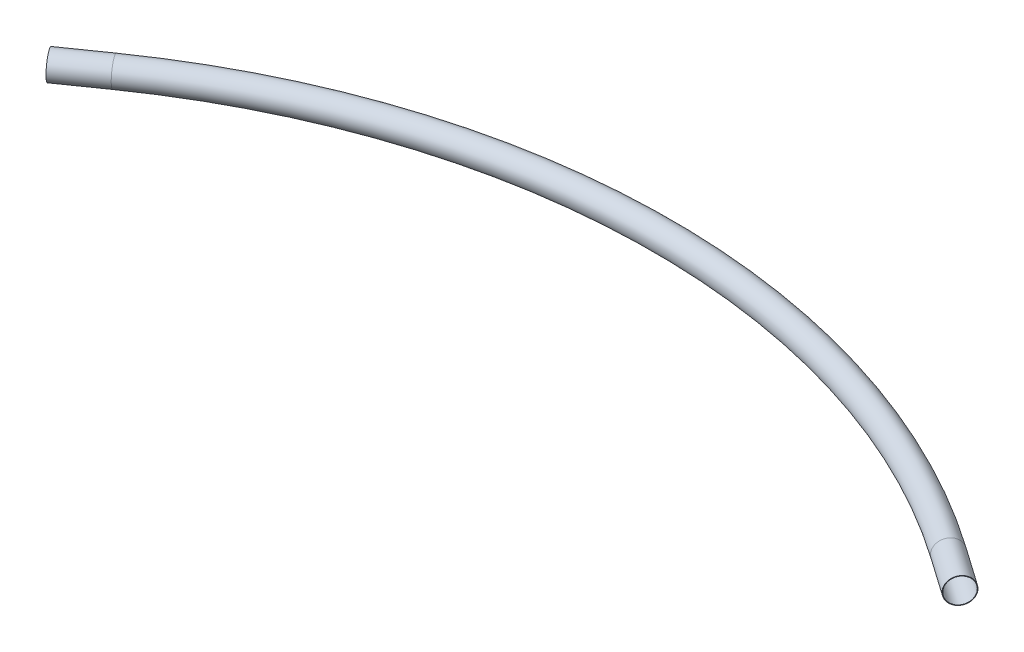
ISO-10303-21;
HEADER;
FILE_DESCRIPTION(('STEP AP214'),'2;1');
FILE_NAME('part.step','',(''),(''),'','','');
FILE_SCHEMA(('AUTOMOTIVE_DESIGN { 1 0 10303 214 1 1 1 1 }'));
ENDSEC;
DATA;
#1=APPLICATION_CONTEXT('core data for automotive mechanical design processes');
#2=APPLICATION_PROTOCOL_DEFINITION('international standard','automotive_design',2000,#1);
#3=PRODUCT_CONTEXT('',#1,'mechanical');
#4=PRODUCT('Part','Part','',(#3));
#5=PRODUCT_RELATED_PRODUCT_CATEGORY('part','',(#4));
#6=PRODUCT_DEFINITION_FORMATION('','',#4);
#7=PRODUCT_DEFINITION_CONTEXT('part definition',#1,'design');
#8=PRODUCT_DEFINITION('design','',#6,#7);
#9=PRODUCT_DEFINITION_SHAPE('','',#8);
#10=(LENGTH_UNIT() NAMED_UNIT(*) SI_UNIT(.MILLI.,.METRE.));
#11=(NAMED_UNIT(*) PLANE_ANGLE_UNIT() SI_UNIT($,.RADIAN.));
#12=(NAMED_UNIT(*) SI_UNIT($,.STERADIAN.) SOLID_ANGLE_UNIT());
#13=UNCERTAINTY_MEASURE_WITH_UNIT(LENGTH_MEASURE(1.E-05),#10,'distance_accuracy_value','');
#14=(GEOMETRIC_REPRESENTATION_CONTEXT(3) GLOBAL_UNCERTAINTY_ASSIGNED_CONTEXT((#13)) GLOBAL_UNIT_ASSIGNED_CONTEXT((#10,
#11,#12)) REPRESENTATION_CONTEXT('',''));
#15=CARTESIAN_POINT('',(0.,0.,0.));
#16=DIRECTION('',(0.,0.,1.));
#17=DIRECTION('',(1.,0.,0.));
#18=AXIS2_PLACEMENT_3D('',#15,#16,#17);
#19=CARTESIAN_POINT('',(-2964.33247070961,0.,174.783348954667));
#20=DIRECTION('',(0.819250231986912,0.,-0.573436184234471));
#21=DIRECTION('',(-0.573436184234471,0.,-0.819250231986912));
#22=AXIS2_PLACEMENT_3D('',#19,#20,#21);
#23=CYLINDRICAL_SURFACE('',#22,80.7338999999999);
#24=CARTESIAN_POINT('',(-2964.33247070961,0.,174.783348954667));
#25=DIRECTION('',(-0.819250231986912,0.,0.573436184234472));
#26=DIRECTION('',(0.573436184234472,0.,0.819250231986912));
#27=AXIS2_PLACEMENT_3D('',#24,#25,#26);
#28=CIRCLE('',#27,80.7338999999999);
#29=CARTESIAN_POINT('',(-2918.03673115524,0.,240.924615258875));
#30=VERTEX_POINT('',#29);
#31=EDGE_CURVE('E52',#30,#30,#28,.T.);
#32=ORIENTED_EDGE('',*,*,#31,.T.);
#33=EDGE_LOOP('',(#32));
#34=FACE_BOUND('',#33,.T.);
#35=CARTESIAN_POINT('',(-2714.625,0.,0.));
#36=DIRECTION('',(-0.819250231986912,0.,0.573436184234472));
#37=DIRECTION('',(0.573436184234472,0.,0.819250231986912));
#38=AXIS2_PLACEMENT_3D('',#35,#36,#37);
#39=CIRCLE('',#38,80.7338999999999);
#40=CARTESIAN_POINT('',(-2668.32926044563,0.,66.1412663042081));
#41=VERTEX_POINT('',#40);
#42=EDGE_CURVE('E58',#41,#41,#39,.T.);
#43=ORIENTED_EDGE('',*,*,#42,.F.);
#44=EDGE_LOOP('',(#43));
#45=FACE_BOUND('',#44,.T.);
#46=ADVANCED_FACE('F45',(#34,#45),#23,.F.);
#47=CARTESIAN_POINT('',(-2964.33247070961,0.,174.783348954667));
#48=DIRECTION('',(0.819250231986912,0.,-0.573436184234471));
#49=DIRECTION('',(-0.573436184234471,0.,-0.819250231986912));
#50=AXIS2_PLACEMENT_3D('',#47,#48,#49);
#51=CYLINDRICAL_SURFACE('',#50,84.1375000000001);
#52=CARTESIAN_POINT('',(-2964.33247070961,0.,174.783348954667));
#53=DIRECTION('',(-0.819250231986912,0.,0.573436184234472));
#54=DIRECTION('',(0.573436184234472,0.,0.819250231986912));
#55=AXIS2_PLACEMENT_3D('',#52,#53,#54);
#56=CIRCLE('',#55,84.1375000000001);
#57=CARTESIAN_POINT('',(-2916.08498375858,0.,243.713015348466));
#58=VERTEX_POINT('',#57);
#59=EDGE_CURVE('E12',#58,#58,#56,.T.);
#60=ORIENTED_EDGE('',*,*,#59,.F.);
#61=EDGE_LOOP('',(#60));
#62=FACE_BOUND('',#61,.T.);
#63=CARTESIAN_POINT('',(-2714.625,0.,0.));
#64=DIRECTION('',(-0.819250231986912,0.,0.573436184234472));
#65=DIRECTION('',(0.573436184234472,0.,0.819250231986912));
#66=AXIS2_PLACEMENT_3D('',#63,#64,#65);
#67=CIRCLE('',#66,84.1375000000001);
#68=CARTESIAN_POINT('',(-2666.37751304897,0.,68.9296663937989));
#69=VERTEX_POINT('',#68);
#70=EDGE_CURVE('E48',#69,#69,#67,.T.);
#71=ORIENTED_EDGE('',*,*,#70,.T.);
#72=EDGE_LOOP('',(#71));
#73=FACE_BOUND('',#72,.T.);
#74=ADVANCED_FACE('F65',(#62,#73),#51,.T.);
#75=CARTESIAN_POINT('',(-2964.33247070961,0.,174.783348954667));
#76=DIRECTION('',(-0.819250231986912,0.,0.573436184234472));
#77=DIRECTION('',(0.573436184234472,0.,0.819250231986912));
#78=AXIS2_PLACEMENT_3D('',#75,#76,#77);
#79=PLANE('',#78);
#80=ORIENTED_EDGE('',*,*,#31,.F.);
#81=EDGE_LOOP('',(#80));
#82=FACE_BOUND('',#81,.T.);
#83=ORIENTED_EDGE('',*,*,#59,.T.);
#84=EDGE_LOOP('',(#83));
#85=FACE_BOUND('',#84,.T.);
#86=ADVANCED_FACE('F69',(#82,#85),#79,.T.);
#87=CARTESIAN_POINT('',(-2714.625,0.,0.));
#88=DIRECTION('',(-0.819250231986912,0.,0.573436184234472));
#89=DIRECTION('',(0.573436184234472,0.,0.819250231986912));
#90=AXIS2_PLACEMENT_3D('',#87,#88,#89);
#91=PLANE('',#90);
#92=ORIENTED_EDGE('',*,*,#42,.T.);
#93=EDGE_LOOP('',(#92));
#94=FACE_BOUND('',#93,.T.);
#95=ORIENTED_EDGE('',*,*,#70,.F.);
#96=EDGE_LOOP('',(#95));
#97=FACE_BOUND('',#96,.T.);
#98=ADVANCED_FACE('F67',(#94,#97),#91,.F.);
#99=CLOSED_SHELL('',(#46,#74,#86,#98));
#100=MANIFOLD_SOLID_BREP('B2',#99);
#101=CARTESIAN_POINT('',(0.,0.,3878.29931586271));
#102=DIRECTION('',(0.,-1.,0.));
#103=DIRECTION('',(0.,0.,-1.));
#104=AXIS2_PLACEMENT_3D('',#101,#102,#103);
#105=TOROIDAL_SURFACE('',#104,4733.96181586271,80.7338999999999);
#106=CARTESIAN_POINT('',(-2714.625,0.,0.));
#107=DIRECTION('',(-0.819250231986912,0.,0.573436184234471));
#108=DIRECTION('',(0.573436184234472,0.,0.819250231986912));
#109=AXIS2_PLACEMENT_3D('',#106,#107,#108);
#110=CIRCLE('',#109,80.7338999999999);
#111=CARTESIAN_POINT('',(-2760.92073955437,0.,-66.141266304208));
#112=VERTEX_POINT('',#111);
#113=EDGE_CURVE('E129',#112,#112,#110,.T.);
#114=CARTESIAN_POINT('',(2714.625,0.,6.66133814775094E-13));
#115=DIRECTION('',(-0.819250231986912,0.,-0.573436184234471));
#116=DIRECTION('',(-0.573436184234471,0.,0.819250231986912));
#117=AXIS2_PLACEMENT_3D('',#114,#115,#116);
#118=CIRCLE('',#117,80.7338999999999);
#119=CARTESIAN_POINT('',(2760.92073955437,0.,-66.1412663042076));
#120=VERTEX_POINT('',#119);
#121=EDGE_CURVE('E137',#120,#120,#118,.T.);
#122=CARTESIAN_POINT('',(0.,0.,3878.29931586271));
#123=DIRECTION('',(0.,-1.,0.));
#124=DIRECTION('',(0.,0.,-1.));
#125=AXIS2_PLACEMENT_3D('',#122,#123,#124);
#126=CIRCLE('',#125,4814.69571586271);
#127=EDGE_CURVE('',#112,#120,#126,.T.);
#128=ORIENTED_EDGE('',*,*,#113,.T.);
#129=ORIENTED_EDGE('',*,*,#121,.F.);
#130=ORIENTED_EDGE('',*,*,#127,.T.);
#131=ORIENTED_EDGE('',*,*,#127,.F.);
#132=EDGE_LOOP('',(#128,#130,#129,#131));
#133=FACE_BOUND('',#132,.T.);
#134=ADVANCED_FACE('F122',(#133),#105,.F.);
#135=CARTESIAN_POINT('',(0.,0.,3878.29931586271));
#136=DIRECTION('',(0.,-1.,0.));
#137=DIRECTION('',(0.,0.,-1.));
#138=AXIS2_PLACEMENT_3D('',#135,#136,#137);
#139=TOROIDAL_SURFACE('',#138,4733.96181586271,84.1375000000001);
#140=CARTESIAN_POINT('',(-2714.625,0.,0.));
#141=DIRECTION('',(-0.819250231986912,0.,0.573436184234471));
#142=DIRECTION('',(0.573436184234472,0.,0.819250231986912));
#143=AXIS2_PLACEMENT_3D('',#140,#141,#142);
#144=CIRCLE('',#143,84.1375000000001);
#145=CARTESIAN_POINT('',(-2762.87248695103,0.,-68.9296663937986));
#146=VERTEX_POINT('',#145);
#147=EDGE_CURVE('E44',#146,#146,#144,.T.);
#148=CARTESIAN_POINT('',(2714.625,0.,6.66133814775094E-13));
#149=DIRECTION('',(-0.819250231986912,0.,-0.573436184234471));
#150=DIRECTION('',(-0.573436184234471,0.,0.819250231986912));
#151=AXIS2_PLACEMENT_3D('',#148,#149,#150);
#152=CIRCLE('',#151,84.1375000000001);
#153=CARTESIAN_POINT('',(2762.87248695103,0.,-68.9296663937977));
#154=VERTEX_POINT('',#153);
#155=EDGE_CURVE('E133',#154,#154,#152,.T.);
#156=CARTESIAN_POINT('',(0.,0.,3878.29931586271));
#157=DIRECTION('',(0.,-1.,0.));
#158=DIRECTION('',(0.,0.,-1.));
#159=AXIS2_PLACEMENT_3D('',#156,#157,#158);
#160=CIRCLE('',#159,4818.09931586271);
#161=EDGE_CURVE('',#146,#154,#160,.T.);
#162=ORIENTED_EDGE('',*,*,#147,.F.);
#163=ORIENTED_EDGE('',*,*,#155,.T.);
#164=ORIENTED_EDGE('',*,*,#161,.T.);
#165=ORIENTED_EDGE('',*,*,#161,.F.);
#166=EDGE_LOOP('',(#162,#164,#163,#165));
#167=FACE_BOUND('',#166,.T.);
#168=ADVANCED_FACE('F124',(#167),#139,.T.);
#169=CARTESIAN_POINT('',(-2714.625,0.,0.));
#170=DIRECTION('',(-0.819250231986912,0.,0.573436184234471));
#171=DIRECTION('',(0.573436184234472,0.,0.819250231986912));
#172=AXIS2_PLACEMENT_3D('',#169,#170,#171);
#173=PLANE('',#172);
#174=ORIENTED_EDGE('',*,*,#113,.F.);
#175=EDGE_LOOP('',(#174));
#176=FACE_BOUND('',#175,.T.);
#177=ORIENTED_EDGE('',*,*,#147,.T.);
#178=EDGE_LOOP('',(#177));
#179=FACE_BOUND('',#178,.T.);
#180=ADVANCED_FACE('F147',(#176,#179),#173,.T.);
#181=CARTESIAN_POINT('',(2714.625,0.,6.66133814775094E-13));
#182=DIRECTION('',(-0.819250231986912,0.,-0.573436184234471));
#183=DIRECTION('',(-0.573436184234471,0.,0.819250231986912));
#184=AXIS2_PLACEMENT_3D('',#181,#182,#183);
#185=PLANE('',#184);
#186=ORIENTED_EDGE('',*,*,#121,.T.);
#187=EDGE_LOOP('',(#186));
#188=FACE_BOUND('',#187,.T.);
#189=ORIENTED_EDGE('',*,*,#155,.F.);
#190=EDGE_LOOP('',(#189));
#191=FACE_BOUND('',#190,.T.);
#192=ADVANCED_FACE('F143',(#188,#191),#185,.F.);
#193=CLOSED_SHELL('',(#134,#168,#180,#192));
#194=MANIFOLD_SOLID_BREP('B7',#193);
#195=CARTESIAN_POINT('',(2714.625,0.,6.66133814775094E-13));
#196=DIRECTION('',(0.819250231986912,0.,0.573436184234471));
#197=DIRECTION('',(0.573436184234471,0.,-0.819250231986912));
#198=AXIS2_PLACEMENT_3D('',#195,#196,#197);
#199=CYLINDRICAL_SURFACE('',#198,80.7338999999999);
#200=CARTESIAN_POINT('',(2714.625,0.,6.66133814775094E-13));
#201=DIRECTION('',(-0.819250231986912,0.,-0.573436184234471));
#202=DIRECTION('',(-0.573436184234471,0.,0.819250231986912));
#203=AXIS2_PLACEMENT_3D('',#200,#201,#202);
#204=CIRCLE('',#203,80.7338999999999);
#205=CARTESIAN_POINT('',(2760.92073955437,0.,-66.1412663042074));
#206=VERTEX_POINT('',#205);
#207=EDGE_CURVE('E199',#206,#206,#204,.T.);
#208=CARTESIAN_POINT('',(2964.33247070961,0.,174.783348954667));
#209=DIRECTION('',(-0.819250231986912,0.,-0.573436184234471));
#210=DIRECTION('',(-0.573436184234471,0.,0.819250231986912));
#211=AXIS2_PLACEMENT_3D('',#208,#209,#210);
#212=CIRCLE('',#211,80.7338999999999);
#213=CARTESIAN_POINT('',(3010.62821026398,0.,108.642082650459));
#214=VERTEX_POINT('',#213);
#215=EDGE_CURVE('E205',#214,#214,#212,.T.);
#216=CARTESIAN_POINT('',(2760.92073955437,0.,-66.1412663042074));
#217=CARTESIAN_POINT('',(2763.52185904093,0.,-64.320606419263));
#218=CARTESIAN_POINT('',(2766.12297852748,0.,-62.4999465343185));
#219=CARTESIAN_POINT('',(2771.3252175006,0.,-58.8586267644296));
#220=CARTESIAN_POINT('',(2773.92633698716,0.,-57.0379668794851));
#221=CARTESIAN_POINT('',(2779.12857596028,0.,-53.3966471095962));
#222=CARTESIAN_POINT('',(2781.72969544684,0.,-51.5759872246518));
#223=CARTESIAN_POINT('',(2786.93193441995,0.,-47.934667454763));
#224=CARTESIAN_POINT('',(2789.53305390651,0.,-46.1140075698185));
#225=CARTESIAN_POINT('',(2794.73529287963,0.,-42.4726877999296));
#226=CARTESIAN_POINT('',(2797.33641236619,0.,-40.6520279149851));
#227=CARTESIAN_POINT('',(2802.5386513393,0.,-37.0107081450963));
#228=CARTESIAN_POINT('',(2805.13977082586,0.,-35.1900482601518));
#229=CARTESIAN_POINT('',(2810.34200979898,0.,-31.5487284902629));
#230=CARTESIAN_POINT('',(2812.94312928554,0.,-29.7280686053185));
#231=CARTESIAN_POINT('',(2818.14536825865,0.,-26.0867488354296));
#232=CARTESIAN_POINT('',(2820.74648774521,0.,-24.2660889504852));
#233=CARTESIAN_POINT('',(2825.94872671833,0.,-20.6247691805963));
#234=CARTESIAN_POINT('',(2828.54984620489,0.,-18.8041092956518));
#235=CARTESIAN_POINT('',(2833.752085178,0.,-15.1627895257629));
#236=CARTESIAN_POINT('',(2836.35320466456,0.,-13.3421296408185));
#237=CARTESIAN_POINT('',(2841.55544363768,0.,-9.70080987092958));
#238=CARTESIAN_POINT('',(2844.15656312424,0.,-7.88014998598518));
#239=CARTESIAN_POINT('',(2849.35880209735,0.,-4.23883021609631));
#240=CARTESIAN_POINT('',(2851.95992158391,0.,-2.41817033115184));
#241=CARTESIAN_POINT('',(2857.16216055703,0.,1.22314943873707));
#242=CARTESIAN_POINT('',(2859.76328004359,0.,3.0438093236815));
#243=CARTESIAN_POINT('',(2864.96551901671,0.,6.68512909357039));
#244=CARTESIAN_POINT('',(2867.56663850326,0.,8.50578897851485));
#245=CARTESIAN_POINT('',(2872.76887747638,0.,12.1471087484037));
#246=CARTESIAN_POINT('',(2875.36999696294,0.,13.9677686333482));
#247=CARTESIAN_POINT('',(2880.57223593606,0.,17.6090884032371));
#248=CARTESIAN_POINT('',(2883.17335542261,0.,19.4297482881815));
#249=CARTESIAN_POINT('',(2888.37559439573,0.,23.0710680580704));
#250=CARTESIAN_POINT('',(2890.97671388229,0.,24.8917279430148));
#251=CARTESIAN_POINT('',(2896.17895285541,0.,28.5330477129037));
#252=CARTESIAN_POINT('',(2898.78007234197,0.,30.3537075978482));
#253=CARTESIAN_POINT('',(2903.98231131508,0.,33.9950273677371));
#254=CARTESIAN_POINT('',(2906.58343080164,0.,35.8156872526815));
#255=CARTESIAN_POINT('',(2911.78566977476,0.,39.4570070225704));
#256=CARTESIAN_POINT('',(2914.38678926132,0.,41.2776669075148));
#257=CARTESIAN_POINT('',(2919.58902823443,0.,44.9189866774037));
#258=CARTESIAN_POINT('',(2922.19014772099,0.,46.7396465623482));
#259=CARTESIAN_POINT('',(2927.39238669411,0.,50.3809663322371));
#260=CARTESIAN_POINT('',(2929.99350618067,0.,52.2016262171815));
#261=CARTESIAN_POINT('',(2935.19574515378,0.,55.8429459870704));
#262=CARTESIAN_POINT('',(2937.79686464034,0.,57.6636058720148));
#263=CARTESIAN_POINT('',(2942.99910361346,0.,61.3049256419037));
#264=CARTESIAN_POINT('',(2945.60022310002,0.,63.1255855268482));
#265=CARTESIAN_POINT('',(2950.80246207313,0.,66.7669052967371));
#266=CARTESIAN_POINT('',(2953.40358155969,0.,68.5875651816815));
#267=CARTESIAN_POINT('',(2958.60582053281,0.,72.2288849515704));
#268=CARTESIAN_POINT('',(2961.20694001937,0.,74.0495448365149));
#269=CARTESIAN_POINT('',(2966.40917899249,0.,77.6908646064037));
#270=CARTESIAN_POINT('',(2969.01029847904,0.,79.5115244913481));
#271=CARTESIAN_POINT('',(2974.21253745216,0.,83.152844261237));
#272=CARTESIAN_POINT('',(2976.81365693872,0.,84.9735041461815));
#273=CARTESIAN_POINT('',(2982.01589591184,0.,88.6148239160704));
#274=CARTESIAN_POINT('',(2984.61701539839,0.,90.4354838010149));
#275=CARTESIAN_POINT('',(2989.81925437151,0.,94.0768035709037));
#276=CARTESIAN_POINT('',(2992.42037385807,0.,95.8974634558482));
#277=CARTESIAN_POINT('',(2997.62261283119,0.,99.538783225737));
#278=CARTESIAN_POINT('',(3000.22373231774,0.,101.359443110681));
#279=CARTESIAN_POINT('',(3005.42597129086,0.,105.00076288057));
#280=CARTESIAN_POINT('',(3008.02709077742,0.,106.821422765515));
#281=CARTESIAN_POINT('',(3010.62821026398,0.,108.642082650459));
#282=B_SPLINE_CURVE_WITH_KNOTS('',3,(#216,#217,#218,#219,#220,#221,#222,#223,#224,#225,#226,
#227,#228,#229,#230,#231,#232,#233,#234,#235,#236,#237,#238,#239,#240,#241,#242,#243,#244,#245,
#246,#247,#248,#249,#250,#251,#252,#253,#254,#255,#256,#257,#258,#259,#260,#261,#262,#263,#264,
#265,#266,#267,#268,#269,#270,#271,#272,#273,#274,#275,#276,#277,#278,#279,#280,#281),
.UNSPECIFIED.,.F.,.F.,(4,2,2,2,2,2,2,2,2,2,2,2,2,2,2,2,2,2,2,2,2,2,2,2,2,2,2,2,2,2,2,2,4),(0.,
9.52499999999995,19.0499999999999,28.5750000000002,38.1000000000002,47.6250000000001,
57.1500000000001,66.675,76.2,85.7249999999999,95.2499999999999,104.775,114.3,123.825,133.35,
142.875,152.4,161.925,171.45,180.975,190.5,200.025,209.55,219.075,228.6,238.125,247.65,257.175,
266.7,276.225,285.75,295.275,304.8),.UNSPECIFIED.);
#283=EDGE_CURVE('BSEAM192',#206,#214,#282,.T.);
#284=ORIENTED_EDGE('',*,*,#207,.T.);
#285=ORIENTED_EDGE('',*,*,#215,.F.);
#286=ORIENTED_EDGE('',*,*,#283,.T.);
#287=ORIENTED_EDGE('',*,*,#283,.F.);
#288=EDGE_LOOP('',(#284,#286,#285,#287));
#289=FACE_BOUND('',#288,.T.);
#290=ADVANCED_FACE('F192',(#289),#199,.F.);
#291=CARTESIAN_POINT('',(2714.625,0.,6.66133814775094E-13));
#292=DIRECTION('',(0.819250231986912,0.,0.573436184234471));
#293=DIRECTION('',(0.573436184234471,0.,-0.819250231986912));
#294=AXIS2_PLACEMENT_3D('',#291,#292,#293);
#295=CYLINDRICAL_SURFACE('',#294,84.1375000000001);
#296=CARTESIAN_POINT('',(2714.625,0.,6.66133814775094E-13));
#297=DIRECTION('',(-0.819250231986912,0.,-0.573436184234471));
#298=DIRECTION('',(-0.573436184234471,0.,0.819250231986912));
#299=AXIS2_PLACEMENT_3D('',#296,#297,#298);
#300=CIRCLE('',#299,84.1375000000001);
#301=CARTESIAN_POINT('',(2762.87248695103,0.,-68.9296663937982));
#302=VERTEX_POINT('',#301);
#303=EDGE_CURVE('E121',#302,#302,#300,.T.);
#304=CARTESIAN_POINT('',(2964.33247070961,0.,174.783348954667));
#305=DIRECTION('',(-0.819250231986912,0.,-0.573436184234471));
#306=DIRECTION('',(-0.573436184234471,0.,0.819250231986912));
#307=AXIS2_PLACEMENT_3D('',#304,#305,#306);
#308=CIRCLE('',#307,84.1375000000001);
#309=CARTESIAN_POINT('',(3012.57995766064,0.,105.853682560868));
#310=VERTEX_POINT('',#309);
#311=EDGE_CURVE('E195',#310,#310,#308,.T.);
#312=CARTESIAN_POINT('',(2762.87248695103,0.,-68.9296663937982));
#313=CARTESIAN_POINT('',(2765.47360643759,0.,-67.1090065088538));
#314=CARTESIAN_POINT('',(2768.07472592415,0.,-65.2883466239093));
#315=CARTESIAN_POINT('',(2773.27696489726,0.,-61.6470268540205));
#316=CARTESIAN_POINT('',(2775.87808438382,0.,-59.826366969076));
#317=CARTESIAN_POINT('',(2781.08032335694,0.,-56.1850471991871));
#318=CARTESIAN_POINT('',(2783.6814428435,0.,-54.3643873142426));
#319=CARTESIAN_POINT('',(2788.88368181661,0.,-50.7230675443538));
#320=CARTESIAN_POINT('',(2791.48480130317,0.,-48.9024076594094));
#321=CARTESIAN_POINT('',(2796.68704027629,0.,-45.2610878895205));
#322=CARTESIAN_POINT('',(2799.28815976285,0.,-43.440428004576));
#323=CARTESIAN_POINT('',(2804.49039873596,0.,-39.7991082346871));
#324=CARTESIAN_POINT('',(2807.09151822252,0.,-37.9784483497427));
#325=CARTESIAN_POINT('',(2812.29375719564,0.,-34.3371285798538));
#326=CARTESIAN_POINT('',(2814.8948766822,0.,-32.5164686949093));
#327=CARTESIAN_POINT('',(2820.09711565531,0.,-28.8751489250205));
#328=CARTESIAN_POINT('',(2822.69823514187,0.,-27.054489040076));
#329=CARTESIAN_POINT('',(2827.90047411499,0.,-23.4131692701871));
#330=CARTESIAN_POINT('',(2830.50159360155,0.,-21.5925093852427));
#331=CARTESIAN_POINT('',(2835.70383257466,0.,-17.9511896153538));
#332=CARTESIAN_POINT('',(2838.30495206122,0.,-16.1305297304094));
#333=CARTESIAN_POINT('',(2843.50719103434,0.,-12.4892099605204));
#334=CARTESIAN_POINT('',(2846.1083105209,0.,-10.668550075576));
#335=CARTESIAN_POINT('',(2851.31054949402,0.,-7.02723030568711));
#336=CARTESIAN_POINT('',(2853.91166898057,0.,-5.20657042074272));
#337=CARTESIAN_POINT('',(2859.11390795369,0.,-1.56525065085384));
#338=CARTESIAN_POINT('',(2861.71502744025,0.,0.255409234090641));
#339=CARTESIAN_POINT('',(2866.91726641337,0.,3.89672900397956));
#340=CARTESIAN_POINT('',(2869.51838589992,0.,5.71738888892399));
#341=CARTESIAN_POINT('',(2874.72062487304,0.,9.35870865881287));
#342=CARTESIAN_POINT('',(2877.3217443596,0.,11.1793685437573));
#343=CARTESIAN_POINT('',(2882.52398333272,0.,14.8206883136462));
#344=CARTESIAN_POINT('',(2885.12510281928,0.,16.6413481985906));
#345=CARTESIAN_POINT('',(2890.32734179239,0.,20.2826679684795));
#346=CARTESIAN_POINT('',(2892.92846127895,0.,22.103327853424));
#347=CARTESIAN_POINT('',(2898.13070025207,0.,25.7446476233129));
#348=CARTESIAN_POINT('',(2900.73181973863,0.,27.5653075082574));
#349=CARTESIAN_POINT('',(2905.93405871174,0.,31.2066272781462));
#350=CARTESIAN_POINT('',(2908.5351781983,0.,33.0272871630906));
#351=CARTESIAN_POINT('',(2913.73741717142,0.,36.6686069329795));
#352=CARTESIAN_POINT('',(2916.33853665798,0.,38.489266817924));
#353=CARTESIAN_POINT('',(2921.54077563109,0.,42.1305865878129));
#354=CARTESIAN_POINT('',(2924.14189511765,0.,43.9512464727573));
#355=CARTESIAN_POINT('',(2929.34413409077,0.,47.5925662426462));
#356=CARTESIAN_POINT('',(2931.94525357733,0.,49.4132261275906));
#357=CARTESIAN_POINT('',(2937.14749255044,0.,53.0545458974795));
#358=CARTESIAN_POINT('',(2939.748612037,0.,54.875205782424));
#359=CARTESIAN_POINT('',(2944.95085101012,0.,58.5165255523129));
#360=CARTESIAN_POINT('',(2947.55197049668,0.,60.3371854372573));
#361=CARTESIAN_POINT('',(2952.75420946979,0.,63.9785052071462));
#362=CARTESIAN_POINT('',(2955.35532895635,0.,65.7991650920906));
#363=CARTESIAN_POINT('',(2960.55756792947,0.,69.4404848619796));
#364=CARTESIAN_POINT('',(2963.15868741603,0.,71.261144746924));
#365=CARTESIAN_POINT('',(2968.36092638915,0.,74.9024645168129));
#366=CARTESIAN_POINT('',(2970.9620458757,0.,76.7231244017573));
#367=CARTESIAN_POINT('',(2976.16428484882,0.,80.3644441716462));
#368=CARTESIAN_POINT('',(2978.76540433538,0.,82.1851040565907));
#369=CARTESIAN_POINT('',(2983.9676433085,0.,85.8264238264796));
#370=CARTESIAN_POINT('',(2986.56876279505,0.,87.647083711424));
#371=CARTESIAN_POINT('',(2991.77100176817,0.,91.2884034813129));
#372=CARTESIAN_POINT('',(2994.37212125473,0.,93.1090633662573));
#373=CARTESIAN_POINT('',(2999.57436022785,0.,96.7503831361462));
#374=CARTESIAN_POINT('',(3002.17547971441,0.,98.5710430210907));
#375=CARTESIAN_POINT('',(3007.37771868752,0.,102.21236279098));
#376=CARTESIAN_POINT('',(3009.97883817408,0.,104.033022675924));
#377=CARTESIAN_POINT('',(3012.57995766064,0.,105.853682560868));
#378=B_SPLINE_CURVE_WITH_KNOTS('',3,(#312,#313,#314,#315,#316,#317,#318,#319,#320,#321,#322,
#323,#324,#325,#326,#327,#328,#329,#330,#331,#332,#333,#334,#335,#336,#337,#338,#339,#340,#341,
#342,#343,#344,#345,#346,#347,#348,#349,#350,#351,#352,#353,#354,#355,#356,#357,#358,#359,#360,
#361,#362,#363,#364,#365,#366,#367,#368,#369,#370,#371,#372,#373,#374,#375,#376,#377),
.UNSPECIFIED.,.F.,.F.,(4,2,2,2,2,2,2,2,2,2,2,2,2,2,2,2,2,2,2,2,2,2,2,2,2,2,2,2,2,2,2,2,4),(0.,
9.52499999999995,19.0499999999999,28.5749999999998,38.1000000000002,47.6250000000001,
57.1500000000001,66.675,76.2,85.7249999999999,95.2499999999999,104.775,114.3,123.825,133.35,
142.875,152.4,161.925,171.45,180.975,190.5,200.025,209.55,219.075,228.6,238.125,247.65,257.175,
266.7,276.225,285.75,295.275,304.8),.UNSPECIFIED.);
#379=EDGE_CURVE('BSEAM212',#302,#310,#378,.T.);
#380=ORIENTED_EDGE('',*,*,#303,.F.);
#381=ORIENTED_EDGE('',*,*,#311,.T.);
#382=ORIENTED_EDGE('',*,*,#379,.T.);
#383=ORIENTED_EDGE('',*,*,#379,.F.);
#384=EDGE_LOOP('',(#380,#382,#381,#383));
#385=FACE_BOUND('',#384,.T.);
#386=ADVANCED_FACE('F212',(#385),#295,.T.);
#387=CARTESIAN_POINT('',(2714.625,0.,6.66133814775094E-13));
#388=DIRECTION('',(-0.819250231986912,0.,-0.573436184234471));
#389=DIRECTION('',(-0.573436184234471,0.,0.819250231986912));
#390=AXIS2_PLACEMENT_3D('',#387,#388,#389);
#391=PLANE('',#390);
#392=ORIENTED_EDGE('',*,*,#207,.F.);
#393=EDGE_LOOP('',(#392));
#394=FACE_BOUND('',#393,.T.);
#395=ORIENTED_EDGE('',*,*,#303,.T.);
#396=EDGE_LOOP('',(#395));
#397=FACE_BOUND('',#396,.T.);
#398=ADVANCED_FACE('F216',(#394,#397),#391,.T.);
#399=CARTESIAN_POINT('',(2964.33247070961,0.,174.783348954667));
#400=DIRECTION('',(-0.819250231986912,0.,-0.573436184234471));
#401=DIRECTION('',(-0.573436184234471,0.,0.819250231986912));
#402=AXIS2_PLACEMENT_3D('',#399,#400,#401);
#403=PLANE('',#402);
#404=ORIENTED_EDGE('',*,*,#215,.T.);
#405=EDGE_LOOP('',(#404));
#406=FACE_BOUND('',#405,.T.);
#407=ORIENTED_EDGE('',*,*,#311,.F.);
#408=EDGE_LOOP('',(#407));
#409=FACE_BOUND('',#408,.T.);
#410=ADVANCED_FACE('F214',(#406,#409),#403,.F.);
#411=CLOSED_SHELL('',(#290,#386,#398,#410));
#412=MANIFOLD_SOLID_BREP('B39',#411);
#413=ADVANCED_BREP_SHAPE_REPRESENTATION('',(#18,#100,#194,#412),#14);
#414=SHAPE_DEFINITION_REPRESENTATION(#9,#413);
ENDSEC;
END-ISO-10303-21;
